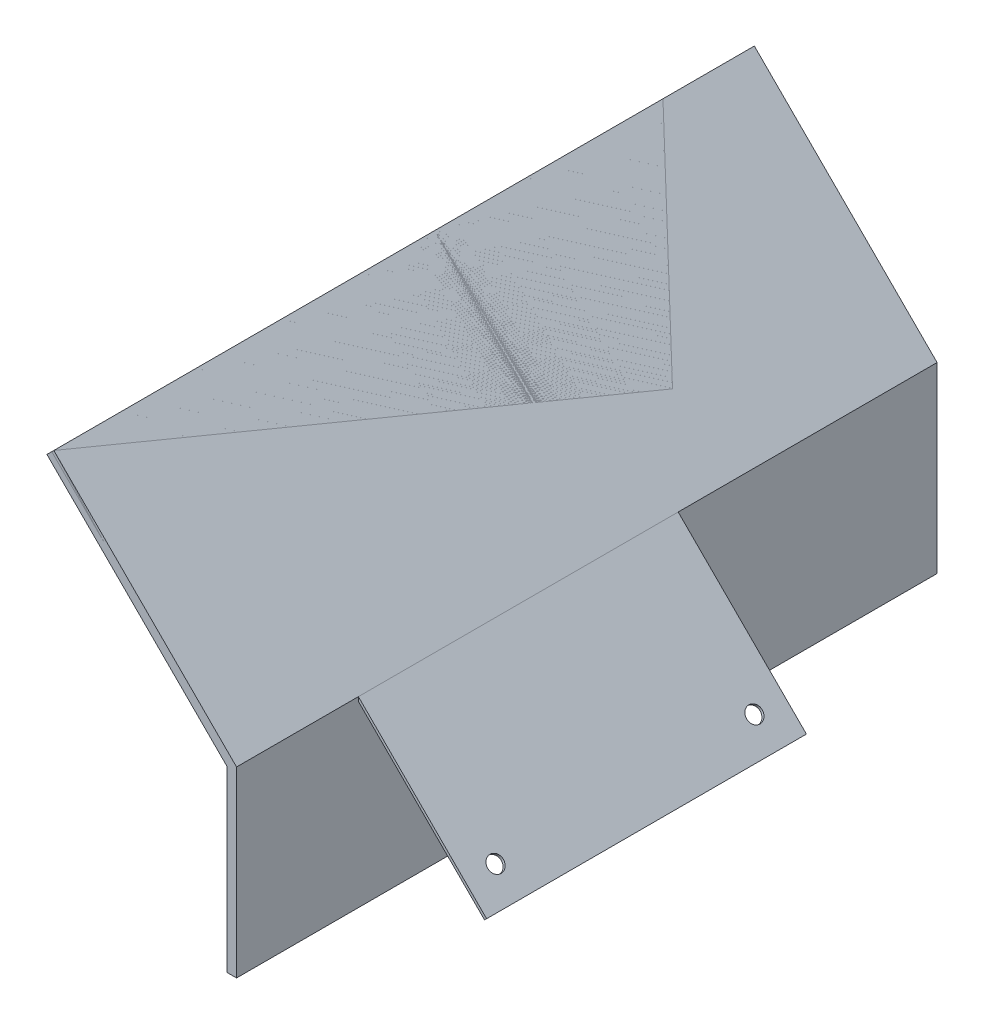
ISO-10303-21;
HEADER;
FILE_DESCRIPTION(('STEP AP214'),'2;1');
FILE_NAME('part.step','',(''),(''),'','','');
FILE_SCHEMA(('AUTOMOTIVE_DESIGN { 1 0 10303 214 1 1 1 1 }'));
ENDSEC;
DATA;
#1=APPLICATION_CONTEXT('core data for automotive mechanical design processes');
#2=APPLICATION_PROTOCOL_DEFINITION('international standard','automotive_design',2000,#1);
#3=PRODUCT_CONTEXT('',#1,'mechanical');
#4=PRODUCT('Part','Part','',(#3));
#5=PRODUCT_RELATED_PRODUCT_CATEGORY('part','',(#4));
#6=PRODUCT_DEFINITION_FORMATION('','',#4);
#7=PRODUCT_DEFINITION_CONTEXT('part definition',#1,'design');
#8=PRODUCT_DEFINITION('design','',#6,#7);
#9=PRODUCT_DEFINITION_SHAPE('','',#8);
#10=(LENGTH_UNIT() NAMED_UNIT(*) SI_UNIT(.MILLI.,.METRE.));
#11=(NAMED_UNIT(*) PLANE_ANGLE_UNIT() SI_UNIT($,.RADIAN.));
#12=(NAMED_UNIT(*) SI_UNIT($,.STERADIAN.) SOLID_ANGLE_UNIT());
#13=UNCERTAINTY_MEASURE_WITH_UNIT(LENGTH_MEASURE(1.E-05),#10,'distance_accuracy_value','');
#14=(GEOMETRIC_REPRESENTATION_CONTEXT(3) GLOBAL_UNCERTAINTY_ASSIGNED_CONTEXT((#13)) GLOBAL_UNIT_ASSIGNED_CONTEXT((#10,
#11,#12)) REPRESENTATION_CONTEXT('',''));
#15=CARTESIAN_POINT('',(0.,0.,0.));
#16=DIRECTION('',(0.,0.,1.));
#17=DIRECTION('',(1.,0.,0.));
#18=AXIS2_PLACEMENT_3D('',#15,#16,#17);
#19=CARTESIAN_POINT('',(-44.123681638538,-78.9253169424675,-50.8));
#20=DIRECTION('',(0.,0.,-1.));
#21=DIRECTION('',(-0.707106781186546,-0.707106781186549,0.));
#22=AXIS2_PLACEMENT_3D('',#19,#20,#21);
#23=PLANE('',#22);
#24=DIRECTION('',(-0.707106781186549,0.707106781186546,0.));
#25=VECTOR('',#24,1.);
#26=CARTESIAN_POINT('',(57.5328176519647,22.7311823480355,-50.8));
#27=LINE('',#26,#25);
#28=CARTESIAN_POINT('',(57.5328176519647,22.7311823480355,-50.8));
#29=VERTEX_POINT('',#28);
#30=CARTESIAN_POINT('',(3.33641809728114,76.9275819027189,-50.8));
#31=VERTEX_POINT('',#30);
#32=EDGE_CURVE('E187',#29,#31,#27,.T.);
#33=ORIENTED_EDGE('',*,*,#32,.T.);
#34=DIRECTION('',(1.,0.,0.));
#35=VECTOR('',#34,1.);
#36=CARTESIAN_POINT('',(-139.7,76.9275819027189,-50.8));
#37=LINE('',#36,#35);
#38=CARTESIAN_POINT('',(1.61939312693272,76.9275819027189,-50.8));
#39=VERTEX_POINT('',#38);
#40=EDGE_CURVE('E153',#39,#31,#37,.T.);
#41=ORIENTED_EDGE('',*,*,#40,.F.);
#42=DIRECTION('',(-0.707106781186549,0.707106781186546,0.));
#43=VECTOR('',#42,1.);
#44=CARTESIAN_POINT('',(56.6743051667905,21.8726698628613,-50.8));
#45=LINE('',#44,#43);
#46=CARTESIAN_POINT('',(56.6743051667905,21.8726698628613,-50.8));
#47=VERTEX_POINT('',#46);
#48=EDGE_CURVE('E185',#47,#39,#45,.T.);
#49=ORIENTED_EDGE('',*,*,#48,.F.);
#50=DIRECTION('',(0.707106781186546,0.707106781186549,0.));
#51=VECTOR('',#50,1.);
#52=CARTESIAN_POINT('',(-44.123681638538,-78.9253169424675,-50.8));
#53=LINE('',#52,#51);
#54=EDGE_CURVE('E183',#47,#29,#53,.T.);
#55=ORIENTED_EDGE('',*,*,#54,.T.);
#56=EDGE_LOOP('',(#33,#41,#49,#55));
#57=FACE_BOUND('',#56,.T.);
#58=ADVANCED_FACE('F61',(#57),#23,.F.);
#59=CARTESIAN_POINT('',(57.5328176519647,22.7311823480355,-292.1));
#60=DIRECTION('',(-0.707106781186549,0.707106781186546,0.));
#61=DIRECTION('',(0.,0.,1.));
#62=AXIS2_PLACEMENT_3D('',#59,#60,#61);
#63=PLANE('',#62);
#64=DIRECTION('',(0.707106781186546,0.707106781186549,0.));
#65=VECTOR('',#64,1.);
#66=CARTESIAN_POINT('',(-44.1236816385379,-78.9253169424675,-184.15));
#67=LINE('',#66,#65);
#68=CARTESIAN_POINT('',(56.6743051667905,21.8726698628613,-184.15));
#69=VERTEX_POINT('',#68);
#70=CARTESIAN_POINT('',(57.5328176519647,22.7311823480355,-184.15));
#71=VERTEX_POINT('',#70);
#72=EDGE_CURVE('E177',#69,#71,#67,.T.);
#73=ORIENTED_EDGE('',*,*,#72,.T.);
#74=DIRECTION('',(0.,0.,1.));
#75=VECTOR('',#74,1.);
#76=CARTESIAN_POINT('',(57.5328176519647,22.7311823480355,-292.1));
#77=LINE('',#76,#75);
#78=EDGE_CURVE('E13',#71,#29,#77,.T.);
#79=ORIENTED_EDGE('',*,*,#78,.T.);
#80=ORIENTED_EDGE('',*,*,#54,.F.);
#81=DIRECTION('',(0.,0.,1.));
#82=VECTOR('',#81,1.);
#83=CARTESIAN_POINT('',(56.6743051667905,21.8726698628613,-292.1));
#84=LINE('',#83,#82);
#85=EDGE_CURVE('E65',#69,#47,#84,.T.);
#86=ORIENTED_EDGE('',*,*,#85,.F.);
#87=EDGE_LOOP('',(#73,#79,#80,#86));
#88=FACE_BOUND('',#87,.T.);
#89=ADVANCED_FACE('F218',(#88),#63,.F.);
#90=CARTESIAN_POINT('',(4.06400000000002,76.2,-292.1));
#91=DIRECTION('',(0.707106781186546,0.707106781186549,0.));
#92=DIRECTION('',(-0.707106781186549,0.707106781186546,0.));
#93=AXIS2_PLACEMENT_3D('',#90,#91,#92);
#94=PLANE('',#93);
#95=CARTESIAN_POINT('',(48.5525615308955,31.7114384691046,-171.45));
#96=DIRECTION('',(0.707106781186546,0.707106781186549,0.));
#97=DIRECTION('',(-0.707106781186549,0.707106781186546,0.));
#98=AXIS2_PLACEMENT_3D('',#95,#96,#97);
#99=CIRCLE('',#98,3.26389999999998);
#100=CARTESIAN_POINT('',(46.2446357077808,34.0193642922194,-171.45));
#101=VERTEX_POINT('',#100);
#102=EDGE_CURVE('E174',#101,#101,#99,.T.);
#103=ORIENTED_EDGE('',*,*,#102,.F.);
#104=EDGE_LOOP('',(#103));
#105=FACE_BOUND('',#104,.T.);
#106=CARTESIAN_POINT('',(48.5525615308955,31.7114384691047,-63.5));
#107=DIRECTION('',(0.707106781186546,0.707106781186549,0.));
#108=DIRECTION('',(-0.707106781186549,0.707106781186546,0.));
#109=AXIS2_PLACEMENT_3D('',#106,#107,#108);
#110=CIRCLE('',#109,3.26389999999999);
#111=CARTESIAN_POINT('',(46.2446357077808,34.0193642922194,-63.5));
#112=VERTEX_POINT('',#111);
#113=EDGE_CURVE('E167',#112,#112,#110,.T.);
#114=ORIENTED_EDGE('',*,*,#113,.F.);
#115=EDGE_LOOP('',(#114));
#116=FACE_BOUND('',#115,.T.);
#117=DIRECTION('',(0.707106781186549,-0.707106781186546,0.));
#118=VECTOR('',#117,1.);
#119=CARTESIAN_POINT('',(57.5328176519647,22.7311823480355,-184.15));
#120=LINE('',#119,#118);
#121=CARTESIAN_POINT('',(3.33641809728114,76.9275819027189,-184.15));
#122=VERTEX_POINT('',#121);
#123=EDGE_CURVE('E181',#122,#71,#120,.T.);
#124=ORIENTED_EDGE('',*,*,#123,.F.);
#125=DIRECTION('',(0.,0.,1.));
#126=VECTOR('',#125,1.);
#127=CARTESIAN_POINT('',(3.33641809728114,76.9275819027189,-292.1));
#128=LINE('',#127,#126);
#129=CARTESIAN_POINT('',(3.33641809728114,76.9275819027189,-254.));
#130=VERTEX_POINT('',#129);
#131=EDGE_CURVE('E171',#122,#130,#128,.F.);
#132=ORIENTED_EDGE('',*,*,#131,.T.);
#133=DIRECTION('',(0.707106781186549,-0.707106781186546,0.));
#134=VECTOR('',#133,1.);
#135=CARTESIAN_POINT('',(4.06400000000002,76.2,-254.));
#136=LINE('',#135,#134);
#137=CARTESIAN_POINT('',(-72.1360000000003,152.4,-254.));
#138=VERTEX_POINT('',#137);
#139=EDGE_CURVE('E133',#138,#130,#136,.T.);
#140=ORIENTED_EDGE('',*,*,#139,.F.);
#141=DIRECTION('',(0.,0.,1.));
#142=VECTOR('',#141,1.);
#143=CARTESIAN_POINT('',(-72.1360000000002,152.4,-292.1));
#144=LINE('',#143,#142);
#145=CARTESIAN_POINT('',(-72.1360000000002,152.4,0.));
#146=VERTEX_POINT('',#145);
#147=EDGE_CURVE('E127',#138,#146,#144,.T.);
#148=ORIENTED_EDGE('',*,*,#147,.T.);
#149=DIRECTION('',(-0.707106781186549,0.707106781186546,0.));
#150=VECTOR('',#149,1.);
#151=CARTESIAN_POINT('',(4.06400000000002,76.2,0.));
#152=LINE('',#151,#150);
#153=CARTESIAN_POINT('',(3.33641809728115,76.9275819027189,0.));
#154=VERTEX_POINT('',#153);
#155=EDGE_CURVE('E131',#154,#146,#152,.T.);
#156=ORIENTED_EDGE('',*,*,#155,.F.);
#157=EDGE_CURVE('E136',#154,#31,#128,.F.);
#158=ORIENTED_EDGE('',*,*,#157,.T.);
#159=ORIENTED_EDGE('',*,*,#32,.F.);
#160=ORIENTED_EDGE('',*,*,#78,.F.);
#161=EDGE_LOOP('',(#124,#132,#140,#148,#156,#158,#159,#160));
#162=FACE_BOUND('',#161,.T.);
#163=ADVANCED_FACE('F63',(#105,#116,#162),#94,.T.);
#164=CARTESIAN_POINT('',(56.6743051667905,21.8726698628613,-292.1));
#165=DIRECTION('',(0.707106781186546,0.707106781186549,0.));
#166=DIRECTION('',(-0.707106781186549,0.707106781186546,0.));
#167=AXIS2_PLACEMENT_3D('',#164,#165,#166);
#168=PLANE('',#167);
#169=CARTESIAN_POINT('',(47.6940490457213,30.8529259839304,-171.45));
#170=DIRECTION('',(-0.707106781186546,-0.707106781186549,0.));
#171=DIRECTION('',(0.707106781186549,-0.707106781186546,0.));
#172=AXIS2_PLACEMENT_3D('',#169,#170,#171);
#173=CIRCLE('',#172,3.26389999999998);
#174=CARTESIAN_POINT('',(50.0019748688361,28.5450001608157,-171.45));
#175=VERTEX_POINT('',#174);
#176=EDGE_CURVE('E164',#175,#175,#173,.T.);
#177=ORIENTED_EDGE('',*,*,#176,.F.);
#178=EDGE_LOOP('',(#177));
#179=FACE_BOUND('',#178,.T.);
#180=CARTESIAN_POINT('',(47.6940490457213,30.8529259839304,-63.5));
#181=DIRECTION('',(-0.707106781186546,-0.707106781186549,0.));
#182=DIRECTION('',(0.707106781186549,-0.707106781186546,0.));
#183=AXIS2_PLACEMENT_3D('',#180,#181,#182);
#184=CIRCLE('',#183,3.26389999999999);
#185=CARTESIAN_POINT('',(50.0019748688361,28.5450001608157,-63.5));
#186=VERTEX_POINT('',#185);
#187=EDGE_CURVE('E168',#186,#186,#184,.T.);
#188=ORIENTED_EDGE('',*,*,#187,.F.);
#189=EDGE_LOOP('',(#188));
#190=FACE_BOUND('',#189,.T.);
#191=ORIENTED_EDGE('',*,*,#48,.T.);
#192=DIRECTION('',(0.,0.,-1.));
#193=VECTOR('',#192,1.);
#194=CARTESIAN_POINT('',(1.61939312693272,76.9275819027189,-292.1));
#195=LINE('',#194,#193);
#196=CARTESIAN_POINT('',(1.61939312693273,76.9275819027189,0.));
#197=VERTEX_POINT('',#196);
#198=EDGE_CURVE('E158',#197,#39,#195,.T.);
#199=ORIENTED_EDGE('',*,*,#198,.F.);
#200=DIRECTION('',(-0.707106781186549,0.707106781186546,0.));
#201=VECTOR('',#200,1.);
#202=CARTESIAN_POINT('',(3.20548751482581,75.3414875148258,0.));
#203=LINE('',#202,#201);
#204=CARTESIAN_POINT('',(-72.9945124851745,151.541487514826,0.));
#205=VERTEX_POINT('',#204);
#206=EDGE_CURVE('E196',#197,#205,#203,.T.);
#207=ORIENTED_EDGE('',*,*,#206,.T.);
#208=DIRECTION('',(0.,0.,1.));
#209=VECTOR('',#208,1.);
#210=CARTESIAN_POINT('',(-72.9945124851745,151.541487514826,-292.1));
#211=LINE('',#210,#209);
#212=CARTESIAN_POINT('',(-72.9945124851745,151.541487514826,-254.));
#213=VERTEX_POINT('',#212);
#214=EDGE_CURVE('E142',#213,#205,#211,.T.);
#215=ORIENTED_EDGE('',*,*,#214,.F.);
#216=DIRECTION('',(0.707106781186549,-0.707106781186546,0.));
#217=VECTOR('',#216,1.);
#218=CARTESIAN_POINT('',(3.20548751482581,75.3414875148258,-254.));
#219=LINE('',#218,#217);
#220=CARTESIAN_POINT('',(1.61939312693273,76.9275819027189,-254.));
#221=VERTEX_POINT('',#220);
#222=EDGE_CURVE('E202',#213,#221,#219,.T.);
#223=ORIENTED_EDGE('',*,*,#222,.T.);
#224=DIRECTION('',(0.,0.,1.));
#225=VECTOR('',#224,1.);
#226=CARTESIAN_POINT('',(1.61939312693272,76.9275819027189,-292.1));
#227=LINE('',#226,#225);
#228=CARTESIAN_POINT('',(1.61939312693273,76.9275819027189,-184.15));
#229=VERTEX_POINT('',#228);
#230=EDGE_CURVE('E198',#221,#229,#227,.T.);
#231=ORIENTED_EDGE('',*,*,#230,.T.);
#232=DIRECTION('',(0.707106781186549,-0.707106781186546,0.));
#233=VECTOR('',#232,1.);
#234=CARTESIAN_POINT('',(56.6743051667905,21.8726698628613,-184.15));
#235=LINE('',#234,#233);
#236=EDGE_CURVE('E179',#229,#69,#235,.T.);
#237=ORIENTED_EDGE('',*,*,#236,.T.);
#238=ORIENTED_EDGE('',*,*,#85,.T.);
#239=EDGE_LOOP('',(#191,#199,#207,#215,#223,#231,#237,#238));
#240=FACE_BOUND('',#239,.T.);
#241=ADVANCED_FACE('F195',(#179,#190,#240),#168,.F.);
#242=CARTESIAN_POINT('',(-44.1236816385379,-78.9253169424675,-184.15));
#243=DIRECTION('',(0.,0.,1.));
#244=DIRECTION('',(0.707106781186546,0.707106781186549,0.));
#245=AXIS2_PLACEMENT_3D('',#242,#243,#244);
#246=PLANE('',#245);
#247=ORIENTED_EDGE('',*,*,#236,.F.);
#248=DIRECTION('',(1.,0.,0.));
#249=VECTOR('',#248,1.);
#250=CARTESIAN_POINT('',(-139.7,76.9275819027189,-184.15));
#251=LINE('',#250,#249);
#252=EDGE_CURVE('E146',#229,#122,#251,.T.);
#253=ORIENTED_EDGE('',*,*,#252,.T.);
#254=ORIENTED_EDGE('',*,*,#123,.T.);
#255=ORIENTED_EDGE('',*,*,#72,.F.);
#256=EDGE_LOOP('',(#247,#253,#254,#255));
#257=FACE_BOUND('',#256,.T.);
#258=ADVANCED_FACE('F212',(#257),#246,.F.);
#259=CARTESIAN_POINT('',(254.239939830311,237.398816768521,-63.5));
#260=DIRECTION('',(-0.707106781186546,-0.707106781186549,0.));
#261=DIRECTION('',(0.707106781186549,-0.707106781186546,0.));
#262=AXIS2_PLACEMENT_3D('',#259,#260,#261);
#263=CYLINDRICAL_SURFACE('',#262,3.26389999999999);
#264=ORIENTED_EDGE('',*,*,#113,.T.);
#265=EDGE_LOOP('',(#264));
#266=FACE_BOUND('',#265,.T.);
#267=ORIENTED_EDGE('',*,*,#187,.T.);
#268=EDGE_LOOP('',(#267));
#269=FACE_BOUND('',#268,.T.);
#270=ADVANCED_FACE('F232',(#266,#269),#263,.F.);
#271=CARTESIAN_POINT('',(254.239939830311,237.398816768521,-171.45));
#272=DIRECTION('',(-0.707106781186546,-0.707106781186549,0.));
#273=DIRECTION('',(0.707106781186549,-0.707106781186546,0.));
#274=AXIS2_PLACEMENT_3D('',#271,#272,#273);
#275=CYLINDRICAL_SURFACE('',#274,3.26389999999998);
#276=ORIENTED_EDGE('',*,*,#102,.T.);
#277=EDGE_LOOP('',(#276));
#278=FACE_BOUND('',#277,.T.);
#279=ORIENTED_EDGE('',*,*,#176,.T.);
#280=EDGE_LOOP('',(#279));
#281=FACE_BOUND('',#280,.T.);
#282=ADVANCED_FACE('F237',(#278,#281),#275,.F.);
#283=CARTESIAN_POINT('',(-139.7,76.9275819027189,-292.1));
#284=DIRECTION('',(0.,1.,0.));
#285=DIRECTION('',(0.,0.,1.));
#286=AXIS2_PLACEMENT_3D('',#283,#284,#285);
#287=PLANE('',#286);
#288=ORIENTED_EDGE('',*,*,#230,.F.);
#289=DIRECTION('',(1.,0.,0.));
#290=VECTOR('',#289,1.);
#291=CARTESIAN_POINT('',(-139.7,76.9275819027189,-254.));
#292=LINE('',#291,#290);
#293=EDGE_CURVE('E161',#221,#130,#292,.T.);
#294=ORIENTED_EDGE('',*,*,#293,.T.);
#295=ORIENTED_EDGE('',*,*,#131,.F.);
#296=ORIENTED_EDGE('',*,*,#252,.F.);
#297=EDGE_LOOP('',(#288,#294,#295,#296));
#298=FACE_BOUND('',#297,.T.);
#299=ADVANCED_FACE('F215',(#298),#287,.F.);
#300=CARTESIAN_POINT('',(-139.7,76.9275819027189,0.));
#301=DIRECTION('',(0.,-1.,0.));
#302=DIRECTION('',(0.,0.,-1.));
#303=AXIS2_PLACEMENT_3D('',#300,#301,#302);
#304=PLANE('',#303);
#305=DIRECTION('',(1.,0.,0.));
#306=VECTOR('',#305,1.);
#307=CARTESIAN_POINT('',(-139.7,76.9275819027189,0.));
#308=LINE('',#307,#306);
#309=EDGE_CURVE('E150',#197,#154,#308,.T.);
#310=ORIENTED_EDGE('',*,*,#309,.F.);
#311=ORIENTED_EDGE('',*,*,#198,.T.);
#312=ORIENTED_EDGE('',*,*,#40,.T.);
#313=ORIENTED_EDGE('',*,*,#157,.F.);
#314=EDGE_LOOP('',(#310,#311,#312,#313));
#315=FACE_BOUND('',#314,.T.);
#316=ADVANCED_FACE('F193',(#315),#304,.T.);
#317=CARTESIAN_POINT('',(4.06400000000002,76.2,0.));
#318=DIRECTION('',(0.,0.,-1.));
#319=DIRECTION('',(-0.707106781186549,0.707106781186546,0.));
#320=AXIS2_PLACEMENT_3D('',#317,#318,#319);
#321=PLANE('',#320);
#322=ORIENTED_EDGE('',*,*,#206,.F.);
#323=ORIENTED_EDGE('',*,*,#309,.T.);
#324=ORIENTED_EDGE('',*,*,#155,.T.);
#325=DIRECTION('',(0.707106781186546,0.707106781186549,0.));
#326=VECTOR('',#325,1.);
#327=CARTESIAN_POINT('',(-72.1360000000002,152.4,0.));
#328=LINE('',#327,#326);
#329=EDGE_CURVE('E139',#205,#146,#328,.T.);
#330=ORIENTED_EDGE('',*,*,#329,.F.);
#331=EDGE_LOOP('',(#322,#323,#324,#330));
#332=FACE_BOUND('',#331,.T.);
#333=ADVANCED_FACE('F149',(#332),#321,.F.);
#334=CARTESIAN_POINT('',(-72.1360000000002,152.4,-292.1));
#335=DIRECTION('',(-0.707106781186549,0.707106781186546,0.));
#336=DIRECTION('',(0.,0.,1.));
#337=AXIS2_PLACEMENT_3D('',#334,#335,#336);
#338=PLANE('',#337);
#339=DIRECTION('',(0.707106781186546,0.707106781186549,0.));
#340=VECTOR('',#339,1.);
#341=CARTESIAN_POINT('',(-72.1360000000002,152.4,-254.));
#342=LINE('',#341,#340);
#343=EDGE_CURVE('E197',#213,#138,#342,.T.);
#344=ORIENTED_EDGE('',*,*,#343,.F.);
#345=ORIENTED_EDGE('',*,*,#214,.T.);
#346=ORIENTED_EDGE('',*,*,#329,.T.);
#347=ORIENTED_EDGE('',*,*,#147,.F.);
#348=EDGE_LOOP('',(#344,#345,#346,#347));
#349=FACE_BOUND('',#348,.T.);
#350=ADVANCED_FACE('F140',(#349),#338,.T.);
#351=CARTESIAN_POINT('',(-75.0096819587424,76.9275819027189,-254.));
#352=DIRECTION('',(0.,0.,1.));
#353=DIRECTION('',(1.,0.,0.));
#354=AXIS2_PLACEMENT_3D('',#351,#352,#353);
#355=PLANE('',#354);
#356=ORIENTED_EDGE('',*,*,#343,.T.);
#357=ORIENTED_EDGE('',*,*,#139,.T.);
#358=ORIENTED_EDGE('',*,*,#293,.F.);
#359=ORIENTED_EDGE('',*,*,#222,.F.);
#360=EDGE_LOOP('',(#356,#357,#358,#359));
#361=FACE_BOUND('',#360,.T.);
#362=ADVANCED_FACE('F217',(#361),#355,.F.);
#363=CLOSED_SHELL('',(#58,#89,#163,#241,#258,#270,#282,#299,#316,#333,#350,#362));
#364=MANIFOLD_SOLID_BREP('B2',#363);
#365=CARTESIAN_POINT('',(0.,74.5166360825157,-292.1));
#366=DIRECTION('',(-1.,0.,0.));
#367=DIRECTION('',(0.,0.,1.));
#368=AXIS2_PLACEMENT_3D('',#365,#366,#367);
#369=PLANE('',#368);
#370=DIRECTION('',(0.,-1.,0.));
#371=VECTOR('',#370,1.);
#372=CARTESIAN_POINT('',(0.,74.5166360825157,0.));
#373=LINE('',#372,#371);
#374=CARTESIAN_POINT('',(0.,74.5166360825157,0.));
#375=VERTEX_POINT('',#374);
#376=CARTESIAN_POINT('',(0.,0.,0.));
#377=VERTEX_POINT('',#376);
#378=EDGE_CURVE('E463',#375,#377,#373,.T.);
#379=ORIENTED_EDGE('',*,*,#378,.F.);
#380=DIRECTION('',(0.,0.,1.));
#381=VECTOR('',#380,1.);
#382=CARTESIAN_POINT('',(0.,74.5166360825157,-292.1));
#383=LINE('',#382,#381);
#384=CARTESIAN_POINT('',(0.,74.5166360825157,-292.1));
#385=VERTEX_POINT('',#384);
#386=EDGE_CURVE('E59',#385,#375,#383,.T.);
#387=ORIENTED_EDGE('',*,*,#386,.F.);
#388=DIRECTION('',(0.,-1.,0.));
#389=VECTOR('',#388,1.);
#390=CARTESIAN_POINT('',(0.,74.5166360825157,-292.1));
#391=LINE('',#390,#389);
#392=CARTESIAN_POINT('',(0.,0.,-292.1));
#393=VERTEX_POINT('',#392);
#394=EDGE_CURVE('E475',#385,#393,#391,.T.);
#395=ORIENTED_EDGE('',*,*,#394,.T.);
#396=DIRECTION('',(0.,0.,1.));
#397=VECTOR('',#396,1.);
#398=CARTESIAN_POINT('',(0.,0.,-292.1));
#399=LINE('',#398,#397);
#400=EDGE_CURVE('E381',#393,#377,#399,.T.);
#401=ORIENTED_EDGE('',*,*,#400,.T.);
#402=EDGE_LOOP('',(#379,#387,#395,#401));
#403=FACE_BOUND('',#402,.T.);
#404=ADVANCED_FACE('F378',(#403),#369,.T.);
#405=CARTESIAN_POINT('',(0.,74.5166360825157,-292.1));
#406=DIRECTION('',(-0.707106781186547,-0.707106781186548,0.));
#407=DIRECTION('',(0.707106781186548,-0.707106781186547,0.));
#408=AXIS2_PLACEMENT_3D('',#405,#406,#407);
#409=PLANE('',#408);
#410=DIRECTION('',(0.707106781186547,-0.707106781186547,0.));
#411=VECTOR('',#410,1.);
#412=CARTESIAN_POINT('',(0.,74.5166360825157,0.));
#413=LINE('',#412,#411);
#414=CARTESIAN_POINT('',(-75.0096819587424,149.526318041258,0.));
#415=VERTEX_POINT('',#414);
#416=EDGE_CURVE('E415',#415,#375,#413,.T.);
#417=ORIENTED_EDGE('',*,*,#416,.F.);
#418=DIRECTION('',(0.,0.,1.));
#419=VECTOR('',#418,1.);
#420=CARTESIAN_POINT('',(-75.0096819587424,149.526318041258,-292.1));
#421=LINE('',#420,#419);
#422=CARTESIAN_POINT('',(-75.0096819587424,149.526318041258,-292.1));
#423=VERTEX_POINT('',#422);
#424=EDGE_CURVE('E387',#423,#415,#421,.T.);
#425=ORIENTED_EDGE('',*,*,#424,.F.);
#426=DIRECTION('',(0.707106781186838,-0.707106781186257,0.));
#427=VECTOR('',#426,1.);
#428=CARTESIAN_POINT('',(-75.0096819587424,149.526318041258,-292.1));
#429=LINE('',#428,#427);
#430=EDGE_CURVE('E395',#423,#385,#429,.T.);
#431=ORIENTED_EDGE('',*,*,#430,.T.);
#432=ORIENTED_EDGE('',*,*,#386,.T.);
#433=EDGE_LOOP('',(#417,#425,#431,#432));
#434=FACE_BOUND('',#433,.T.);
#435=ADVANCED_FACE('F496',(#434),#409,.T.);
#436=CARTESIAN_POINT('',(-72.1360000000003,152.4,-292.1));
#437=DIRECTION('',(-0.707106781186551,0.707106781186544,0.));
#438=DIRECTION('',(-0.707106781186544,-0.707106781186551,0.));
#439=AXIS2_PLACEMENT_3D('',#436,#437,#438);
#440=PLANE('',#439);
#441=DIRECTION('',(-0.707106781186544,-0.707106781186551,0.));
#442=VECTOR('',#441,1.);
#443=CARTESIAN_POINT('',(-72.1360000000003,152.4,0.));
#444=LINE('',#443,#442);
#445=CARTESIAN_POINT('',(-72.1360000000003,152.4,0.));
#446=VERTEX_POINT('',#445);
#447=EDGE_CURVE('E440',#446,#415,#444,.T.);
#448=ORIENTED_EDGE('',*,*,#447,.F.);
#449=DIRECTION('',(0.,0.,1.));
#450=VECTOR('',#449,1.);
#451=CARTESIAN_POINT('',(-72.1360000000003,152.4,-292.1));
#452=LINE('',#451,#450);
#453=CARTESIAN_POINT('',(-72.1360000000003,152.4,-292.1));
#454=VERTEX_POINT('',#453);
#455=EDGE_CURVE('E435',#454,#446,#452,.T.);
#456=ORIENTED_EDGE('',*,*,#455,.F.);
#457=DIRECTION('',(-0.707106781186544,-0.707106781186551,0.));
#458=VECTOR('',#457,1.);
#459=CARTESIAN_POINT('',(-72.1360000000003,152.4,-292.1));
#460=LINE('',#459,#458);
#461=EDGE_CURVE('E438',#454,#423,#460,.T.);
#462=ORIENTED_EDGE('',*,*,#461,.T.);
#463=ORIENTED_EDGE('',*,*,#424,.T.);
#464=EDGE_LOOP('',(#448,#456,#462,#463));
#465=FACE_BOUND('',#464,.T.);
#466=ADVANCED_FACE('F437',(#465),#440,.T.);
#467=CARTESIAN_POINT('',(4.064,76.2,-292.1));
#468=DIRECTION('',(0.707106781186546,0.707106781186549,0.));
#469=DIRECTION('',(-0.707106781186549,0.707106781186546,0.));
#470=AXIS2_PLACEMENT_3D('',#467,#468,#469);
#471=PLANE('',#470);
#472=DIRECTION('',(-0.707106781186549,0.707106781186546,0.));
#473=VECTOR('',#472,1.);
#474=CARTESIAN_POINT('',(4.064,76.2,0.));
#475=LINE('',#474,#473);
#476=CARTESIAN_POINT('',(4.064,76.2,0.));
#477=VERTEX_POINT('',#476);
#478=EDGE_CURVE('E472',#477,#446,#475,.T.);
#479=ORIENTED_EDGE('',*,*,#478,.F.);
#480=DIRECTION('',(0.,0.,1.));
#481=VECTOR('',#480,1.);
#482=CARTESIAN_POINT('',(4.064,76.2,-292.1));
#483=LINE('',#482,#481);
#484=CARTESIAN_POINT('',(4.064,76.2,-292.1));
#485=VERTEX_POINT('',#484);
#486=EDGE_CURVE('E445',#485,#477,#483,.T.);
#487=ORIENTED_EDGE('',*,*,#486,.F.);
#488=DIRECTION('',(-0.707106781186549,0.707106781186546,0.));
#489=VECTOR('',#488,1.);
#490=CARTESIAN_POINT('',(4.064,76.2,-292.1));
#491=LINE('',#490,#489);
#492=EDGE_CURVE('E452',#485,#454,#491,.T.);
#493=ORIENTED_EDGE('',*,*,#492,.T.);
#494=ORIENTED_EDGE('',*,*,#455,.T.);
#495=EDGE_LOOP('',(#479,#487,#493,#494));
#496=FACE_BOUND('',#495,.T.);
#497=ADVANCED_FACE('F455',(#496),#471,.T.);
#498=CARTESIAN_POINT('',(4.06400000000001,0.,-292.1));
#499=DIRECTION('',(1.,0.,0.));
#500=DIRECTION('',(0.,1.,0.));
#501=AXIS2_PLACEMENT_3D('',#498,#499,#500);
#502=PLANE('',#501);
#503=DIRECTION('',(0.,1.,0.));
#504=VECTOR('',#503,1.);
#505=CARTESIAN_POINT('',(4.06400000000001,0.,0.));
#506=LINE('',#505,#504);
#507=CARTESIAN_POINT('',(4.06400000000001,0.,0.));
#508=VERTEX_POINT('',#507);
#509=EDGE_CURVE('E469',#508,#477,#506,.T.);
#510=ORIENTED_EDGE('',*,*,#509,.F.);
#511=DIRECTION('',(0.,0.,1.));
#512=VECTOR('',#511,1.);
#513=CARTESIAN_POINT('',(4.06400000000001,0.,-292.1));
#514=LINE('',#513,#512);
#515=CARTESIAN_POINT('',(4.06400000000001,0.,-292.1));
#516=VERTEX_POINT('',#515);
#517=EDGE_CURVE('E478',#516,#508,#514,.T.);
#518=ORIENTED_EDGE('',*,*,#517,.F.);
#519=DIRECTION('',(0.,1.,0.));
#520=VECTOR('',#519,1.);
#521=CARTESIAN_POINT('',(4.06400000000001,0.,-292.1));
#522=LINE('',#521,#520);
#523=EDGE_CURVE('E456',#516,#485,#522,.T.);
#524=ORIENTED_EDGE('',*,*,#523,.T.);
#525=ORIENTED_EDGE('',*,*,#486,.T.);
#526=EDGE_LOOP('',(#510,#518,#524,#525));
#527=FACE_BOUND('',#526,.T.);
#528=ADVANCED_FACE('F486',(#527),#502,.T.);
#529=CARTESIAN_POINT('',(0.,0.,-292.1));
#530=DIRECTION('',(0.,-1.,0.));
#531=DIRECTION('',(0.,0.,-1.));
#532=AXIS2_PLACEMENT_3D('',#529,#530,#531);
#533=PLANE('',#532);
#534=DIRECTION('',(1.,0.,0.));
#535=VECTOR('',#534,1.);
#536=CARTESIAN_POINT('',(0.,0.,0.));
#537=LINE('',#536,#535);
#538=EDGE_CURVE('E466',#377,#508,#537,.T.);
#539=ORIENTED_EDGE('',*,*,#538,.F.);
#540=ORIENTED_EDGE('',*,*,#400,.F.);
#541=DIRECTION('',(1.,0.,0.));
#542=VECTOR('',#541,1.);
#543=CARTESIAN_POINT('',(0.,0.,-292.1));
#544=LINE('',#543,#542);
#545=EDGE_CURVE('E458',#393,#516,#544,.T.);
#546=ORIENTED_EDGE('',*,*,#545,.T.);
#547=ORIENTED_EDGE('',*,*,#517,.T.);
#548=EDGE_LOOP('',(#539,#540,#546,#547));
#549=FACE_BOUND('',#548,.T.);
#550=ADVANCED_FACE('F482',(#549),#533,.T.);
#551=CARTESIAN_POINT('',(0.,0.,-292.1));
#552=DIRECTION('',(0.,0.,1.));
#553=DIRECTION('',(1.,0.,0.));
#554=AXIS2_PLACEMENT_3D('',#551,#552,#553);
#555=PLANE('',#554);
#556=ORIENTED_EDGE('',*,*,#394,.F.);
#557=ORIENTED_EDGE('',*,*,#430,.F.);
#558=ORIENTED_EDGE('',*,*,#461,.F.);
#559=ORIENTED_EDGE('',*,*,#492,.F.);
#560=ORIENTED_EDGE('',*,*,#523,.F.);
#561=ORIENTED_EDGE('',*,*,#545,.F.);
#562=EDGE_LOOP('',(#556,#557,#558,#559,#560,#561));
#563=FACE_BOUND('',#562,.T.);
#564=ADVANCED_FACE('F450',(#563),#555,.F.);
#565=CARTESIAN_POINT('',(0.,0.,0.));
#566=DIRECTION('',(0.,0.,1.));
#567=DIRECTION('',(1.,0.,0.));
#568=AXIS2_PLACEMENT_3D('',#565,#566,#567);
#569=PLANE('',#568);
#570=ORIENTED_EDGE('',*,*,#378,.T.);
#571=ORIENTED_EDGE('',*,*,#538,.T.);
#572=ORIENTED_EDGE('',*,*,#509,.T.);
#573=ORIENTED_EDGE('',*,*,#478,.T.);
#574=ORIENTED_EDGE('',*,*,#447,.T.);
#575=ORIENTED_EDGE('',*,*,#416,.T.);
#576=EDGE_LOOP('',(#570,#571,#572,#573,#574,#575));
#577=FACE_BOUND('',#576,.T.);
#578=ADVANCED_FACE('F484',(#577),#569,.T.);
#579=CLOSED_SHELL('',(#404,#435,#466,#497,#528,#550,#564,#578));
#580=MANIFOLD_SOLID_BREP('B7_NOT_SHOWN',#579);
#581=ADVANCED_BREP_SHAPE_REPRESENTATION('',(#18,#364,#580),#14);
#582=SHAPE_DEFINITION_REPRESENTATION(#9,#581);
ENDSEC;
END-ISO-10303-21;
